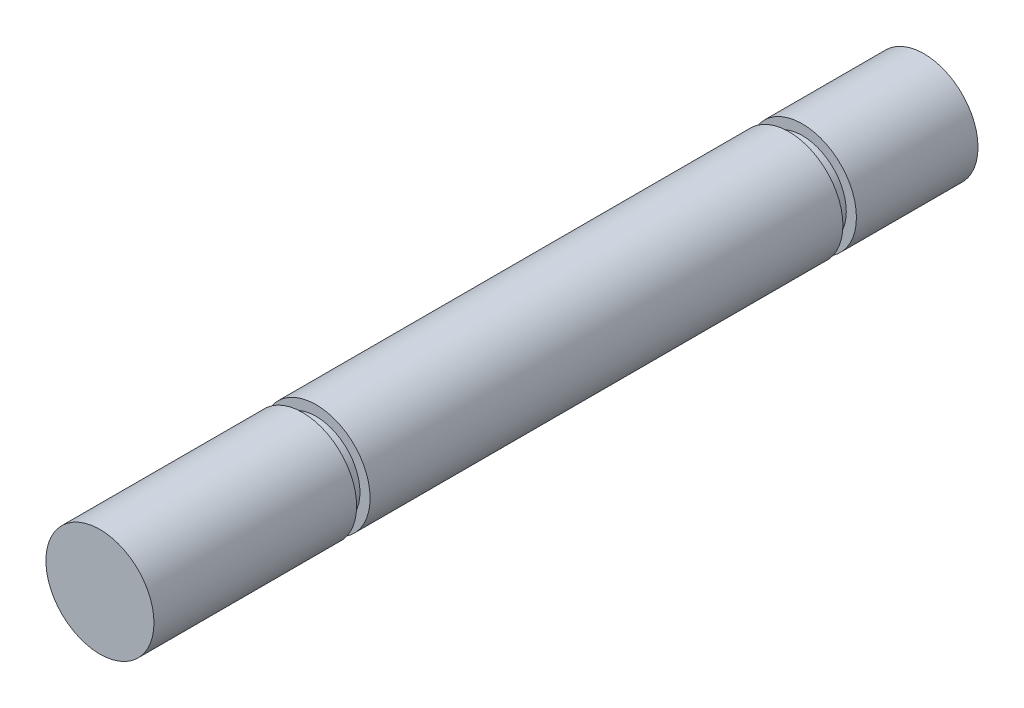
ISO-10303-21;
HEADER;
FILE_DESCRIPTION(('STEP AP214'),'2;1');
FILE_NAME('part.step','',(''),(''),'','','');
FILE_SCHEMA(('AUTOMOTIVE_DESIGN { 1 0 10303 214 1 1 1 1 }'));
ENDSEC;
DATA;
#1=APPLICATION_CONTEXT('core data for automotive mechanical design processes');
#2=APPLICATION_PROTOCOL_DEFINITION('international standard','automotive_design',2000,#1);
#3=PRODUCT_CONTEXT('',#1,'mechanical');
#4=PRODUCT('Part','Part','',(#3));
#5=PRODUCT_RELATED_PRODUCT_CATEGORY('part','',(#4));
#6=PRODUCT_DEFINITION_FORMATION('','',#4);
#7=PRODUCT_DEFINITION_CONTEXT('part definition',#1,'design');
#8=PRODUCT_DEFINITION('design','',#6,#7);
#9=PRODUCT_DEFINITION_SHAPE('','',#8);
#10=(LENGTH_UNIT() NAMED_UNIT(*) SI_UNIT(.MILLI.,.METRE.));
#11=(NAMED_UNIT(*) PLANE_ANGLE_UNIT() SI_UNIT($,.RADIAN.));
#12=(NAMED_UNIT(*) SI_UNIT($,.STERADIAN.) SOLID_ANGLE_UNIT());
#13=UNCERTAINTY_MEASURE_WITH_UNIT(LENGTH_MEASURE(1.E-05),#10,'distance_accuracy_value','');
#14=(GEOMETRIC_REPRESENTATION_CONTEXT(3) GLOBAL_UNCERTAINTY_ASSIGNED_CONTEXT((#13)) GLOBAL_UNIT_ASSIGNED_CONTEXT((#10,
#11,#12)) REPRESENTATION_CONTEXT('',''));
#15=CARTESIAN_POINT('',(0.,0.,0.));
#16=DIRECTION('',(0.,0.,1.));
#17=DIRECTION('',(1.,0.,0.));
#18=AXIS2_PLACEMENT_3D('',#15,#16,#17);
#19=CARTESIAN_POINT('',(0.,4.,16.));
#20=DIRECTION('',(0.,0.,-1.));
#21=DIRECTION('',(1.,0.,0.));
#22=AXIS2_PLACEMENT_3D('',#19,#20,#21);
#23=PLANE('',#22);
#24=CARTESIAN_POINT('',(0.,0.,16.));
#25=DIRECTION('',(0.,0.,1.));
#26=DIRECTION('',(1.,0.,0.));
#27=AXIS2_PLACEMENT_3D('',#24,#25,#26);
#28=CIRCLE('',#27,4.);
#29=CARTESIAN_POINT('',(4.00000000000001,0.,16.));
#30=VERTEX_POINT('',#29);
#31=EDGE_CURVE('E37',#30,#30,#28,.T.);
#32=ORIENTED_EDGE('',*,*,#31,.T.);
#33=EDGE_LOOP('',(#32));
#34=FACE_BOUND('',#33,.T.);
#35=ADVANCED_FACE('F34',(#34),#23,.F.);
#36=CARTESIAN_POINT('',(0.,-4.,-45.));
#37=DIRECTION('',(0.,0.,-1.));
#38=DIRECTION('',(1.,0.,0.));
#39=AXIS2_PLACEMENT_3D('',#36,#37,#38);
#40=PLANE('',#39);
#41=CARTESIAN_POINT('',(0.,0.,-45.));
#42=DIRECTION('',(0.,0.,1.));
#43=DIRECTION('',(1.,0.,0.));
#44=AXIS2_PLACEMENT_3D('',#41,#42,#43);
#45=CIRCLE('',#44,4.);
#46=CARTESIAN_POINT('',(4.00000000000001,0.,-45.));
#47=VERTEX_POINT('',#46);
#48=EDGE_CURVE('E52',#47,#47,#45,.F.);
#49=ORIENTED_EDGE('',*,*,#48,.T.);
#50=EDGE_LOOP('',(#49));
#51=FACE_BOUND('',#50,.T.);
#52=ADVANCED_FACE('F107',(#51),#40,.T.);
#53=CARTESIAN_POINT('',(0.,0.,-45.002));
#54=DIRECTION('',(0.,0.,-1.));
#55=DIRECTION('',(1.,0.,0.));
#56=AXIS2_PLACEMENT_3D('',#53,#54,#55);
#57=CYLINDRICAL_SURFACE('',#56,4.);
#58=ORIENTED_EDGE('',*,*,#31,.F.);
#59=EDGE_LOOP('',(#58));
#60=FACE_BOUND('',#59,.T.);
#61=CARTESIAN_POINT('',(0.,0.,1.));
#62=DIRECTION('',(0.,0.,1.));
#63=DIRECTION('',(1.,0.,0.));
#64=AXIS2_PLACEMENT_3D('',#61,#62,#63);
#65=CIRCLE('',#64,4.);
#66=CARTESIAN_POINT('',(-3.99999999999999,0.,1.));
#67=VERTEX_POINT('',#66);
#68=EDGE_CURVE('E98',#67,#67,#65,.F.);
#69=ORIENTED_EDGE('',*,*,#68,.F.);
#70=EDGE_LOOP('',(#69));
#71=FACE_BOUND('',#70,.T.);
#72=ADVANCED_FACE('F104',(#60,#71),#57,.T.);
#73=CARTESIAN_POINT('',(0.,0.,-45.002));
#74=DIRECTION('',(0.,0.,-1.));
#75=DIRECTION('',(1.,0.,0.));
#76=AXIS2_PLACEMENT_3D('',#73,#74,#75);
#77=CYLINDRICAL_SURFACE('',#76,4.);
#78=ORIENTED_EDGE('',*,*,#48,.F.);
#79=EDGE_LOOP('',(#78));
#80=FACE_BOUND('',#79,.T.);
#81=CARTESIAN_POINT('',(0.,0.,-36.));
#82=DIRECTION('',(0.,0.,1.));
#83=DIRECTION('',(1.,0.,0.));
#84=AXIS2_PLACEMENT_3D('',#81,#82,#83);
#85=CIRCLE('',#84,4.);
#86=CARTESIAN_POINT('',(4.00000000000001,0.,-36.));
#87=VERTEX_POINT('',#86);
#88=EDGE_CURVE('E96',#87,#87,#85,.T.);
#89=ORIENTED_EDGE('',*,*,#88,.F.);
#90=EDGE_LOOP('',(#89));
#91=FACE_BOUND('',#90,.T.);
#92=ADVANCED_FACE('F106',(#80,#91),#77,.T.);
#93=CARTESIAN_POINT('',(0.,4.,1.));
#94=DIRECTION('',(0.,0.,1.));
#95=DIRECTION('',(-1.,0.,0.));
#96=AXIS2_PLACEMENT_3D('',#93,#94,#95);
#97=PLANE('',#96);
#98=ORIENTED_EDGE('',*,*,#68,.T.);
#99=EDGE_LOOP('',(#98));
#100=FACE_BOUND('',#99,.T.);
#101=CARTESIAN_POINT('',(0.,0.,1.));
#102=DIRECTION('',(0.,0.,-1.));
#103=DIRECTION('',(-1.,0.,0.));
#104=AXIS2_PLACEMENT_3D('',#101,#102,#103);
#105=CIRCLE('',#104,3.25);
#106=CARTESIAN_POINT('',(-3.25,0.,1.));
#107=VERTEX_POINT('',#106);
#108=EDGE_CURVE('E94',#107,#107,#105,.F.);
#109=ORIENTED_EDGE('',*,*,#108,.T.);
#110=EDGE_LOOP('',(#109));
#111=FACE_BOUND('',#110,.T.);
#112=ADVANCED_FACE('F101',(#100,#111),#97,.F.);
#113=CARTESIAN_POINT('',(0.,-4.,-36.));
#114=DIRECTION('',(0.,0.,-1.));
#115=DIRECTION('',(1.,0.,0.));
#116=AXIS2_PLACEMENT_3D('',#113,#114,#115);
#117=PLANE('',#116);
#118=CARTESIAN_POINT('',(0.,0.,-36.));
#119=DIRECTION('',(0.,0.,1.));
#120=DIRECTION('',(1.,0.,0.));
#121=AXIS2_PLACEMENT_3D('',#118,#119,#120);
#122=CIRCLE('',#121,3.25);
#123=CARTESIAN_POINT('',(3.25,0.,-36.));
#124=VERTEX_POINT('',#123);
#125=EDGE_CURVE('E92',#124,#124,#122,.F.);
#126=ORIENTED_EDGE('',*,*,#125,.T.);
#127=EDGE_LOOP('',(#126));
#128=FACE_BOUND('',#127,.T.);
#129=ORIENTED_EDGE('',*,*,#88,.T.);
#130=EDGE_LOOP('',(#129));
#131=FACE_BOUND('',#130,.T.);
#132=ADVANCED_FACE('F144',(#128,#131),#117,.F.);
#133=CARTESIAN_POINT('',(0.,0.,1.002));
#134=DIRECTION('',(0.,0.,1.));
#135=DIRECTION('',(-1.,0.,0.));
#136=AXIS2_PLACEMENT_3D('',#133,#134,#135);
#137=CYLINDRICAL_SURFACE('',#136,3.25);
#138=ORIENTED_EDGE('',*,*,#108,.F.);
#139=EDGE_LOOP('',(#138));
#140=FACE_BOUND('',#139,.T.);
#141=CARTESIAN_POINT('',(0.,0.,0.));
#142=DIRECTION('',(0.,0.,-1.));
#143=DIRECTION('',(-1.,0.,0.));
#144=AXIS2_PLACEMENT_3D('',#141,#142,#143);
#145=CIRCLE('',#144,3.25);
#146=CARTESIAN_POINT('',(3.25,0.,0.));
#147=VERTEX_POINT('',#146);
#148=EDGE_CURVE('E88',#147,#147,#145,.T.);
#149=ORIENTED_EDGE('',*,*,#148,.F.);
#150=EDGE_LOOP('',(#149));
#151=FACE_BOUND('',#150,.T.);
#152=ADVANCED_FACE('F153',(#140,#151),#137,.T.);
#153=CARTESIAN_POINT('',(0.,0.,-36.002));
#154=DIRECTION('',(0.,0.,-1.));
#155=DIRECTION('',(1.,0.,0.));
#156=AXIS2_PLACEMENT_3D('',#153,#154,#155);
#157=CYLINDRICAL_SURFACE('',#156,3.25);
#158=ORIENTED_EDGE('',*,*,#125,.F.);
#159=EDGE_LOOP('',(#158));
#160=FACE_BOUND('',#159,.T.);
#161=CARTESIAN_POINT('',(0.,0.,-35.));
#162=DIRECTION('',(0.,0.,1.));
#163=DIRECTION('',(1.,0.,0.));
#164=AXIS2_PLACEMENT_3D('',#161,#162,#163);
#165=CIRCLE('',#164,3.25);
#166=CARTESIAN_POINT('',(3.25,0.,-35.));
#167=VERTEX_POINT('',#166);
#168=EDGE_CURVE('E86',#167,#167,#165,.F.);
#169=ORIENTED_EDGE('',*,*,#168,.T.);
#170=EDGE_LOOP('',(#169));
#171=FACE_BOUND('',#170,.T.);
#172=ADVANCED_FACE('F163',(#160,#171),#157,.T.);
#173=CARTESIAN_POINT('',(0.,0.,0.));
#174=DIRECTION('',(0.,0.,-1.));
#175=DIRECTION('',(1.,0.,0.));
#176=AXIS2_PLACEMENT_3D('',#173,#174,#175);
#177=PLANE('',#176);
#178=CARTESIAN_POINT('',(0.,0.,0.));
#179=DIRECTION('',(0.,0.,1.));
#180=DIRECTION('',(1.,0.,0.));
#181=AXIS2_PLACEMENT_3D('',#178,#179,#180);
#182=CIRCLE('',#181,4.);
#183=CARTESIAN_POINT('',(4.00000000000001,0.,0.));
#184=VERTEX_POINT('',#183);
#185=EDGE_CURVE('E42',#184,#184,#182,.T.);
#186=ORIENTED_EDGE('',*,*,#185,.T.);
#187=EDGE_LOOP('',(#186));
#188=FACE_BOUND('',#187,.T.);
#189=ORIENTED_EDGE('',*,*,#148,.T.);
#190=EDGE_LOOP('',(#189));
#191=FACE_BOUND('',#190,.T.);
#192=ADVANCED_FACE('F173',(#188,#191),#177,.F.);
#193=CARTESIAN_POINT('',(0.,-7.5,-35.));
#194=DIRECTION('',(0.,0.,-1.));
#195=DIRECTION('',(1.,0.,0.));
#196=AXIS2_PLACEMENT_3D('',#193,#194,#195);
#197=PLANE('',#196);
#198=CARTESIAN_POINT('',(0.,0.,-35.));
#199=DIRECTION('',(0.,0.,1.));
#200=DIRECTION('',(1.,0.,0.));
#201=AXIS2_PLACEMENT_3D('',#198,#199,#200);
#202=CIRCLE('',#201,4.);
#203=CARTESIAN_POINT('',(4.00000000000001,0.,-35.));
#204=VERTEX_POINT('',#203);
#205=EDGE_CURVE('E11',#204,#204,#202,.F.);
#206=ORIENTED_EDGE('',*,*,#205,.T.);
#207=EDGE_LOOP('',(#206));
#208=FACE_BOUND('',#207,.T.);
#209=ORIENTED_EDGE('',*,*,#168,.F.);
#210=EDGE_LOOP('',(#209));
#211=FACE_BOUND('',#210,.T.);
#212=ADVANCED_FACE('F77',(#208,#211),#197,.T.);
#213=CARTESIAN_POINT('',(0.,0.,-45.002));
#214=DIRECTION('',(0.,0.,-1.));
#215=DIRECTION('',(1.,0.,0.));
#216=AXIS2_PLACEMENT_3D('',#213,#214,#215);
#217=CYLINDRICAL_SURFACE('',#216,4.);
#218=ORIENTED_EDGE('',*,*,#205,.F.);
#219=EDGE_LOOP('',(#218));
#220=FACE_BOUND('',#219,.T.);
#221=ORIENTED_EDGE('',*,*,#185,.F.);
#222=EDGE_LOOP('',(#221));
#223=FACE_BOUND('',#222,.T.);
#224=ADVANCED_FACE('F80',(#220,#223),#217,.T.);
#225=CLOSED_SHELL('',(#35,#52,#72,#92,#112,#132,#152,#172,#192,#212,#224));
#226=MANIFOLD_SOLID_BREP('B2',#225);
#227=ADVANCED_BREP_SHAPE_REPRESENTATION('',(#18,#226),#14);
#228=SHAPE_DEFINITION_REPRESENTATION(#9,#227);
ENDSEC;
END-ISO-10303-21;
